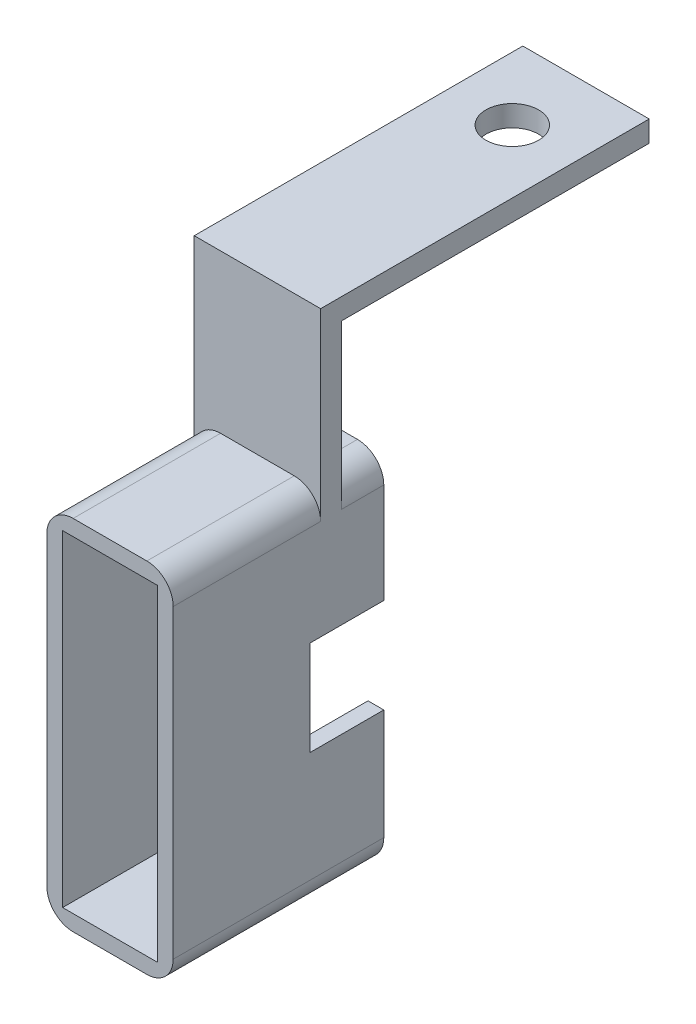
ISO-10303-21;
HEADER;
FILE_DESCRIPTION(('STEP AP214'),'2;1');
FILE_NAME('part.step','',(''),(''),'','','');
FILE_SCHEMA(('AUTOMOTIVE_DESIGN { 1 0 10303 214 1 1 1 1 }'));
ENDSEC;
DATA;
#1=APPLICATION_CONTEXT('core data for automotive mechanical design processes');
#2=APPLICATION_PROTOCOL_DEFINITION('international standard','automotive_design',2000,#1);
#3=PRODUCT_CONTEXT('',#1,'mechanical');
#4=PRODUCT('Part','Part','',(#3));
#5=PRODUCT_RELATED_PRODUCT_CATEGORY('part','',(#4));
#6=PRODUCT_DEFINITION_FORMATION('','',#4);
#7=PRODUCT_DEFINITION_CONTEXT('part definition',#1,'design');
#8=PRODUCT_DEFINITION('design','',#6,#7);
#9=PRODUCT_DEFINITION_SHAPE('','',#8);
#10=(LENGTH_UNIT() NAMED_UNIT(*) SI_UNIT(.MILLI.,.METRE.));
#11=(NAMED_UNIT(*) PLANE_ANGLE_UNIT() SI_UNIT($,.RADIAN.));
#12=(NAMED_UNIT(*) SI_UNIT($,.STERADIAN.) SOLID_ANGLE_UNIT());
#13=UNCERTAINTY_MEASURE_WITH_UNIT(LENGTH_MEASURE(1.E-05),#10,'distance_accuracy_value','');
#14=(GEOMETRIC_REPRESENTATION_CONTEXT(3) GLOBAL_UNCERTAINTY_ASSIGNED_CONTEXT((#13)) GLOBAL_UNIT_ASSIGNED_CONTEXT((#10,
#11,#12)) REPRESENTATION_CONTEXT('',''));
#15=CARTESIAN_POINT('',(0.,0.,0.));
#16=DIRECTION('',(0.,0.,1.));
#17=DIRECTION('',(1.,0.,0.));
#18=AXIS2_PLACEMENT_3D('',#15,#16,#17);
#19=CARTESIAN_POINT('',(0.,0.,0.));
#20=DIRECTION('',(0.,0.,1.));
#21=DIRECTION('',(1.,0.,0.));
#22=AXIS2_PLACEMENT_3D('',#19,#20,#21);
#23=PLANE('',#22);
#24=DIRECTION('',(0.,1.,0.));
#25=VECTOR('',#24,1.);
#26=CARTESIAN_POINT('',(-10.2757146611833,-16.7781690140845,0.));
#27=LINE('',#26,#25);
#28=CARTESIAN_POINT('',(-10.2757146611833,5.2218309859155,0.));
#29=VERTEX_POINT('',#28);
#30=CARTESIAN_POINT('',(-10.2757146611833,14.7218309859155,0.));
#31=VERTEX_POINT('',#30);
#32=EDGE_CURVE('E247',#29,#31,#27,.T.);
#33=ORIENTED_EDGE('',*,*,#32,.F.);
#34=DIRECTION('',(-1.,0.,0.));
#35=VECTOR('',#34,1.);
#36=CARTESIAN_POINT('',(-10.2757026611833,5.2218309859155,0.));
#37=LINE('',#36,#35);
#38=CARTESIAN_POINT('',(-11.7757146611833,5.2218309859155,0.));
#39=VERTEX_POINT('',#38);
#40=EDGE_CURVE('E239',#29,#39,#37,.T.);
#41=ORIENTED_EDGE('',*,*,#40,.T.);
#42=DIRECTION('',(0.,1.,0.));
#43=VECTOR('',#42,1.);
#44=CARTESIAN_POINT('',(-11.7757146611833,15.7218309859155,0.));
#45=LINE('',#44,#43);
#46=CARTESIAN_POINT('',(-11.7757146611833,15.7218309859155,0.));
#47=VERTEX_POINT('',#46);
#48=EDGE_CURVE('E343',#39,#47,#45,.T.);
#49=ORIENTED_EDGE('',*,*,#48,.T.);
#50=DIRECTION('',(-1.,0.,0.));
#51=VECTOR('',#50,1.);
#52=CARTESIAN_POINT('',(-20.7757146611833,15.7218309859155,0.));
#53=LINE('',#52,#51);
#54=CARTESIAN_POINT('',(-20.7757146611833,15.7218309859155,0.));
#55=VERTEX_POINT('',#54);
#56=EDGE_CURVE('E429',#47,#55,#53,.T.);
#57=ORIENTED_EDGE('',*,*,#56,.T.);
#58=DIRECTION('',(0.,-1.,0.));
#59=VECTOR('',#58,1.);
#60=CARTESIAN_POINT('',(-20.7757146611833,15.7218309859155,0.));
#61=LINE('',#60,#59);
#62=CARTESIAN_POINT('',(-20.7757146611833,7.22183098591549,0.));
#63=VERTEX_POINT('',#62);
#64=EDGE_CURVE('E352',#55,#63,#61,.T.);
#65=ORIENTED_EDGE('',*,*,#64,.T.);
#66=DIRECTION('',(1.,0.,0.));
#67=VECTOR('',#66,1.);
#68=CARTESIAN_POINT('',(-22.2757266611833,7.22183098591549,0.));
#69=LINE('',#68,#67);
#70=CARTESIAN_POINT('',(-22.2757146611833,7.22183098591549,0.));
#71=VERTEX_POINT('',#70);
#72=EDGE_CURVE('E60',#71,#63,#69,.T.);
#73=ORIENTED_EDGE('',*,*,#72,.F.);
#74=DIRECTION('',(0.,-1.,0.));
#75=VECTOR('',#74,1.);
#76=CARTESIAN_POINT('',(-22.2757146611833,-12.7781690140845,0.));
#77=LINE('',#76,#75);
#78=CARTESIAN_POINT('',(-22.2757146611833,14.7218309859155,0.));
#79=VERTEX_POINT('',#78);
#80=EDGE_CURVE('E375',#79,#71,#77,.T.);
#81=ORIENTED_EDGE('',*,*,#80,.F.);
#82=CARTESIAN_POINT('',(-19.7757146611833,14.7218309859155,0.));
#83=DIRECTION('',(0.,0.,1.));
#84=DIRECTION('',(1.,0.,0.));
#85=AXIS2_PLACEMENT_3D('',#82,#83,#84);
#86=CIRCLE('',#85,2.5);
#87=CARTESIAN_POINT('',(-19.7757146611833,17.2218309859155,0.));
#88=VERTEX_POINT('',#87);
#89=EDGE_CURVE('E288',#79,#88,#86,.F.);
#90=ORIENTED_EDGE('',*,*,#89,.T.);
#91=DIRECTION('',(-1.,0.,0.));
#92=VECTOR('',#91,1.);
#93=CARTESIAN_POINT('',(-10.2757146611833,17.2218309859155,0.));
#94=LINE('',#93,#92);
#95=CARTESIAN_POINT('',(-12.7757146611833,17.2218309859155,0.));
#96=VERTEX_POINT('',#95);
#97=EDGE_CURVE('E246',#96,#88,#94,.T.);
#98=ORIENTED_EDGE('',*,*,#97,.F.);
#99=CARTESIAN_POINT('',(-12.7757146611833,14.7218309859155,0.));
#100=DIRECTION('',(0.,0.,1.));
#101=DIRECTION('',(1.,0.,0.));
#102=AXIS2_PLACEMENT_3D('',#99,#100,#101);
#103=CIRCLE('',#102,2.5);
#104=EDGE_CURVE('E290',#96,#31,#103,.F.);
#105=ORIENTED_EDGE('',*,*,#104,.T.);
#106=EDGE_LOOP('',(#33,#41,#49,#57,#65,#73,#81,#90,#98,#105));
#107=FACE_BOUND('',#106,.T.);
#108=ADVANCED_FACE('F37',(#107),#23,.F.);
#109=CARTESIAN_POINT('',(-22.2757146611833,32.2218309859155,4.));
#110=DIRECTION('',(0.,0.,1.));
#111=DIRECTION('',(1.,0.,0.));
#112=AXIS2_PLACEMENT_3D('',#109,#110,#111);
#113=PLANE('',#112);
#114=DIRECTION('',(-1.,0.,0.));
#115=VECTOR('',#114,1.);
#116=CARTESIAN_POINT('',(-10.2757146611833,30.2218309859155,4.));
#117=LINE('',#116,#115);
#118=CARTESIAN_POINT('',(-10.2757146611833,30.2218309859155,4.));
#119=VERTEX_POINT('',#118);
#120=CARTESIAN_POINT('',(-22.2757146611833,30.2218309859155,4.));
#121=VERTEX_POINT('',#120);
#122=EDGE_CURVE('E259',#119,#121,#117,.T.);
#123=ORIENTED_EDGE('',*,*,#122,.F.);
#124=DIRECTION('',(0.,-1.,0.));
#125=VECTOR('',#124,1.);
#126=CARTESIAN_POINT('',(-10.2757146611833,32.2218309859155,4.));
#127=LINE('',#126,#125);
#128=CARTESIAN_POINT('',(-10.2757146611833,14.7218309859155,4.));
#129=VERTEX_POINT('',#128);
#130=EDGE_CURVE('E433',#119,#129,#127,.T.);
#131=ORIENTED_EDGE('',*,*,#130,.T.);
#132=CARTESIAN_POINT('',(-12.7757146611833,14.7218309859155,4.));
#133=DIRECTION('',(0.,0.,1.));
#134=DIRECTION('',(1.,0.,0.));
#135=AXIS2_PLACEMENT_3D('',#132,#133,#134);
#136=CIRCLE('',#135,2.5);
#137=CARTESIAN_POINT('',(-12.7757146611833,17.2218309859155,4.));
#138=VERTEX_POINT('',#137);
#139=EDGE_CURVE('E313',#129,#138,#136,.T.);
#140=ORIENTED_EDGE('',*,*,#139,.T.);
#141=DIRECTION('',(-1.,0.,0.));
#142=VECTOR('',#141,1.);
#143=CARTESIAN_POINT('',(-22.2757146611833,17.2218309859155,4.));
#144=LINE('',#143,#142);
#145=CARTESIAN_POINT('',(-19.7757146611833,17.2218309859155,4.));
#146=VERTEX_POINT('',#145);
#147=EDGE_CURVE('E748',#138,#146,#144,.T.);
#148=ORIENTED_EDGE('',*,*,#147,.T.);
#149=CARTESIAN_POINT('',(-19.7757146611833,14.7218309859155,4.));
#150=DIRECTION('',(0.,0.,1.));
#151=DIRECTION('',(1.,0.,0.));
#152=AXIS2_PLACEMENT_3D('',#149,#150,#151);
#153=CIRCLE('',#152,2.5);
#154=CARTESIAN_POINT('',(-22.2757146611833,14.7218309859155,4.));
#155=VERTEX_POINT('',#154);
#156=EDGE_CURVE('E315',#146,#155,#153,.T.);
#157=ORIENTED_EDGE('',*,*,#156,.T.);
#158=DIRECTION('',(0.,-1.,0.));
#159=VECTOR('',#158,1.);
#160=CARTESIAN_POINT('',(-22.2757146611833,32.2218309859155,4.));
#161=LINE('',#160,#159);
#162=EDGE_CURVE('E759',#121,#155,#161,.T.);
#163=ORIENTED_EDGE('',*,*,#162,.F.);
#164=EDGE_LOOP('',(#123,#131,#140,#148,#157,#163));
#165=FACE_BOUND('',#164,.T.);
#166=ADVANCED_FACE('F471',(#165),#113,.F.);
#167=CARTESIAN_POINT('',(-10.2757146611833,17.2218309859155,20.));
#168=DIRECTION('',(0.,-1.,0.));
#169=DIRECTION('',(0.,0.,-1.));
#170=AXIS2_PLACEMENT_3D('',#167,#168,#169);
#171=PLANE('',#170);
#172=ORIENTED_EDGE('',*,*,#147,.F.);
#173=DIRECTION('',(0.,0.,-1.));
#174=VECTOR('',#173,1.);
#175=CARTESIAN_POINT('',(-12.7757146611833,17.2218309859155,20.));
#176=LINE('',#175,#174);
#177=EDGE_CURVE('E282',#138,#96,#176,.T.);
#178=ORIENTED_EDGE('',*,*,#177,.T.);
#179=ORIENTED_EDGE('',*,*,#97,.T.);
#180=DIRECTION('',(0.,0.,-1.));
#181=VECTOR('',#180,1.);
#182=CARTESIAN_POINT('',(-19.7757146611833,17.2218309859155,20.));
#183=LINE('',#182,#181);
#184=EDGE_CURVE('E280',#88,#146,#183,.F.);
#185=ORIENTED_EDGE('',*,*,#184,.T.);
#186=EDGE_LOOP('',(#172,#178,#179,#185));
#187=FACE_BOUND('',#186,.T.);
#188=ADVANCED_FACE('F467',(#187),#171,.F.);
#189=DIRECTION('',(1.,0.,0.));
#190=VECTOR('',#189,1.);
#191=CARTESIAN_POINT('',(-22.2757146611833,17.2218309859155,6.));
#192=LINE('',#191,#190);
#193=CARTESIAN_POINT('',(-19.7757146611833,17.2218309859155,6.));
#194=VERTEX_POINT('',#193);
#195=CARTESIAN_POINT('',(-12.7757146611833,17.2218309859155,6.));
#196=VERTEX_POINT('',#195);
#197=EDGE_CURVE('E418',#194,#196,#192,.T.);
#198=ORIENTED_EDGE('',*,*,#197,.F.);
#199=DIRECTION('',(0.,0.,-1.));
#200=VECTOR('',#199,1.);
#201=CARTESIAN_POINT('',(-19.7757146611833,17.2218309859155,20.));
#202=LINE('',#201,#200);
#203=CARTESIAN_POINT('',(-19.7757146611833,17.2218309859155,20.));
#204=VERTEX_POINT('',#203);
#205=EDGE_CURVE('E311',#194,#204,#202,.F.);
#206=ORIENTED_EDGE('',*,*,#205,.T.);
#207=DIRECTION('',(-1.,0.,0.));
#208=VECTOR('',#207,1.);
#209=CARTESIAN_POINT('',(-10.2757146611833,17.2218309859155,20.));
#210=LINE('',#209,#208);
#211=CARTESIAN_POINT('',(-12.7757146611833,17.2218309859155,20.));
#212=VERTEX_POINT('',#211);
#213=EDGE_CURVE('E263',#212,#204,#210,.T.);
#214=ORIENTED_EDGE('',*,*,#213,.F.);
#215=DIRECTION('',(0.,0.,-1.));
#216=VECTOR('',#215,1.);
#217=CARTESIAN_POINT('',(-12.7757146611833,17.2218309859155,20.));
#218=LINE('',#217,#216);
#219=EDGE_CURVE('E274',#212,#196,#218,.T.);
#220=ORIENTED_EDGE('',*,*,#219,.T.);
#221=EDGE_LOOP('',(#198,#206,#214,#220));
#222=FACE_BOUND('',#221,.T.);
#223=ADVANCED_FACE('F416',(#222),#171,.F.);
#224=CARTESIAN_POINT('',(0.,0.,20.));
#225=DIRECTION('',(0.,0.,1.));
#226=DIRECTION('',(1.,0.,0.));
#227=AXIS2_PLACEMENT_3D('',#224,#225,#226);
#228=PLANE('',#227);
#229=DIRECTION('',(0.,-1.,0.));
#230=VECTOR('',#229,1.);
#231=CARTESIAN_POINT('',(-22.2757146611833,17.2218309859155,20.));
#232=LINE('',#231,#230);
#233=CARTESIAN_POINT('',(-22.2757146611833,14.7218309859155,20.));
#234=VERTEX_POINT('',#233);
#235=CARTESIAN_POINT('',(-22.2757146611833,-14.2781690140845,20.));
#236=VERTEX_POINT('',#235);
#237=EDGE_CURVE('E250',#234,#236,#232,.T.);
#238=ORIENTED_EDGE('',*,*,#237,.T.);
#239=CARTESIAN_POINT('',(-19.7757146611833,-14.2781690140845,20.));
#240=DIRECTION('',(0.,0.,1.));
#241=DIRECTION('',(1.,0.,0.));
#242=AXIS2_PLACEMENT_3D('',#239,#240,#241);
#243=CIRCLE('',#242,2.5);
#244=CARTESIAN_POINT('',(-19.7757146611833,-16.7781690140845,20.));
#245=VERTEX_POINT('',#244);
#246=EDGE_CURVE('E309',#236,#245,#243,.T.);
#247=ORIENTED_EDGE('',*,*,#246,.T.);
#248=DIRECTION('',(1.,0.,0.));
#249=VECTOR('',#248,1.);
#250=CARTESIAN_POINT('',(-22.2757146611833,-16.7781690140845,20.));
#251=LINE('',#250,#249);
#252=CARTESIAN_POINT('',(-12.7757146611833,-16.7781690140845,20.));
#253=VERTEX_POINT('',#252);
#254=EDGE_CURVE('E369',#245,#253,#251,.T.);
#255=ORIENTED_EDGE('',*,*,#254,.T.);
#256=CARTESIAN_POINT('',(-12.7757146611833,-14.2781690140845,20.));
#257=DIRECTION('',(0.,0.,1.));
#258=DIRECTION('',(1.,0.,0.));
#259=AXIS2_PLACEMENT_3D('',#256,#257,#258);
#260=CIRCLE('',#259,2.5);
#261=CARTESIAN_POINT('',(-10.2757146611833,-14.2781690140845,20.));
#262=VERTEX_POINT('',#261);
#263=EDGE_CURVE('E272',#253,#262,#260,.T.);
#264=ORIENTED_EDGE('',*,*,#263,.T.);
#265=DIRECTION('',(0.,1.,0.));
#266=VECTOR('',#265,1.);
#267=CARTESIAN_POINT('',(-10.2757146611833,-16.7781690140845,20.));
#268=LINE('',#267,#266);
#269=CARTESIAN_POINT('',(-10.2757146611833,14.7218309859155,20.));
#270=VERTEX_POINT('',#269);
#271=EDGE_CURVE('E371',#262,#270,#268,.T.);
#272=ORIENTED_EDGE('',*,*,#271,.T.);
#273=CARTESIAN_POINT('',(-12.7757146611833,14.7218309859155,20.));
#274=DIRECTION('',(0.,0.,1.));
#275=DIRECTION('',(1.,0.,0.));
#276=AXIS2_PLACEMENT_3D('',#273,#274,#275);
#277=CIRCLE('',#276,2.5);
#278=EDGE_CURVE('E270',#270,#212,#277,.T.);
#279=ORIENTED_EDGE('',*,*,#278,.T.);
#280=ORIENTED_EDGE('',*,*,#213,.T.);
#281=CARTESIAN_POINT('',(-19.7757146611833,14.7218309859155,20.));
#282=DIRECTION('',(0.,0.,1.));
#283=DIRECTION('',(1.,0.,0.));
#284=AXIS2_PLACEMENT_3D('',#281,#282,#283);
#285=CIRCLE('',#284,2.5);
#286=EDGE_CURVE('E307',#204,#234,#285,.T.);
#287=ORIENTED_EDGE('',*,*,#286,.T.);
#288=EDGE_LOOP('',(#238,#247,#255,#264,#272,#279,#280,#287));
#289=FACE_BOUND('',#288,.T.);
#290=DIRECTION('',(0.,-1.,0.));
#291=VECTOR('',#290,1.);
#292=CARTESIAN_POINT('',(-20.7757146611833,15.7218309859155,20.));
#293=LINE('',#292,#291);
#294=CARTESIAN_POINT('',(-20.7757146611833,15.7218309859155,20.));
#295=VERTEX_POINT('',#294);
#296=CARTESIAN_POINT('',(-20.7757146611833,-15.2781690140845,20.));
#297=VERTEX_POINT('',#296);
#298=EDGE_CURVE('E438',#295,#297,#293,.T.);
#299=ORIENTED_EDGE('',*,*,#298,.F.);
#300=DIRECTION('',(-1.,0.,0.));
#301=VECTOR('',#300,1.);
#302=CARTESIAN_POINT('',(-20.7757146611833,15.7218309859155,20.));
#303=LINE('',#302,#301);
#304=CARTESIAN_POINT('',(-11.7757146611833,15.7218309859155,20.));
#305=VERTEX_POINT('',#304);
#306=EDGE_CURVE('E351',#305,#295,#303,.T.);
#307=ORIENTED_EDGE('',*,*,#306,.F.);
#308=DIRECTION('',(0.,1.,0.));
#309=VECTOR('',#308,1.);
#310=CARTESIAN_POINT('',(-11.7757146611833,15.7218309859155,20.));
#311=LINE('',#310,#309);
#312=CARTESIAN_POINT('',(-11.7757146611833,-15.2781690140845,20.));
#313=VERTEX_POINT('',#312);
#314=EDGE_CURVE('E358',#313,#305,#311,.T.);
#315=ORIENTED_EDGE('',*,*,#314,.F.);
#316=DIRECTION('',(1.,0.,0.));
#317=VECTOR('',#316,1.);
#318=CARTESIAN_POINT('',(-20.7757146611833,-15.2781690140845,20.));
#319=LINE('',#318,#317);
#320=EDGE_CURVE('E440',#297,#313,#319,.T.);
#321=ORIENTED_EDGE('',*,*,#320,.F.);
#322=EDGE_LOOP('',(#299,#307,#315,#321));
#323=FACE_BOUND('',#322,.T.);
#324=ADVANCED_FACE('F395',(#289,#323),#228,.T.);
#325=CARTESIAN_POINT('',(-11.7757146611833,-15.2781690140845,0.));
#326=VERTEX_POINT('',#325);
#327=CARTESIAN_POINT('',(-11.7757146611833,-3.77816901408451,0.));
#328=VERTEX_POINT('',#327);
#329=EDGE_CURVE('E238',#326,#328,#45,.T.);
#330=ORIENTED_EDGE('',*,*,#329,.T.);
#331=DIRECTION('',(-1.,0.,0.));
#332=VECTOR('',#331,1.);
#333=CARTESIAN_POINT('',(-10.2757026611833,-3.77816901408451,0.));
#334=LINE('',#333,#332);
#335=CARTESIAN_POINT('',(-10.2757146611833,-3.77816901408451,0.));
#336=VERTEX_POINT('',#335);
#337=EDGE_CURVE('E52',#336,#328,#334,.T.);
#338=ORIENTED_EDGE('',*,*,#337,.F.);
#339=CARTESIAN_POINT('',(-10.2757146611833,-14.2781690140845,0.));
#340=VERTEX_POINT('',#339);
#341=EDGE_CURVE('E235',#340,#336,#27,.T.);
#342=ORIENTED_EDGE('',*,*,#341,.F.);
#343=CARTESIAN_POINT('',(-12.7757146611833,-14.2781690140845,0.));
#344=DIRECTION('',(0.,0.,1.));
#345=DIRECTION('',(1.,0.,0.));
#346=AXIS2_PLACEMENT_3D('',#343,#344,#345);
#347=CIRCLE('',#346,2.5);
#348=CARTESIAN_POINT('',(-12.7757146611833,-16.7781690140845,0.));
#349=VERTEX_POINT('',#348);
#350=EDGE_CURVE('E265',#340,#349,#347,.F.);
#351=ORIENTED_EDGE('',*,*,#350,.T.);
#352=DIRECTION('',(1.,0.,0.));
#353=VECTOR('',#352,1.);
#354=CARTESIAN_POINT('',(-22.2757146611833,-16.7781690140845,0.));
#355=LINE('',#354,#353);
#356=CARTESIAN_POINT('',(-19.7757146611833,-16.7781690140845,0.));
#357=VERTEX_POINT('',#356);
#358=EDGE_CURVE('E252',#357,#349,#355,.T.);
#359=ORIENTED_EDGE('',*,*,#358,.F.);
#360=CARTESIAN_POINT('',(-19.7757146611833,-14.2781690140845,0.));
#361=DIRECTION('',(0.,0.,1.));
#362=DIRECTION('',(1.,0.,0.));
#363=AXIS2_PLACEMENT_3D('',#360,#361,#362);
#364=CIRCLE('',#363,2.5);
#365=CARTESIAN_POINT('',(-22.2757146611833,-14.2781690140845,0.));
#366=VERTEX_POINT('',#365);
#367=EDGE_CURVE('E285',#357,#366,#364,.F.);
#368=ORIENTED_EDGE('',*,*,#367,.T.);
#369=CARTESIAN_POINT('',(-22.2757146611833,-3.77816901408451,0.));
#370=VERTEX_POINT('',#369);
#371=EDGE_CURVE('E366',#370,#366,#77,.T.);
#372=ORIENTED_EDGE('',*,*,#371,.F.);
#373=DIRECTION('',(1.,0.,0.));
#374=VECTOR('',#373,1.);
#375=CARTESIAN_POINT('',(-22.2757266611833,-3.77816901408451,0.));
#376=LINE('',#375,#374);
#377=CARTESIAN_POINT('',(-20.7757146611833,-3.77816901408451,0.));
#378=VERTEX_POINT('',#377);
#379=EDGE_CURVE('E446',#370,#378,#376,.T.);
#380=ORIENTED_EDGE('',*,*,#379,.T.);
#381=CARTESIAN_POINT('',(-20.7757146611833,-15.2781690140845,0.));
#382=VERTEX_POINT('',#381);
#383=EDGE_CURVE('E431',#378,#382,#61,.T.);
#384=ORIENTED_EDGE('',*,*,#383,.T.);
#385=DIRECTION('',(1.,0.,0.));
#386=VECTOR('',#385,1.);
#387=CARTESIAN_POINT('',(-20.7757146611833,-15.2781690140845,0.));
#388=LINE('',#387,#386);
#389=EDGE_CURVE('E349',#382,#326,#388,.T.);
#390=ORIENTED_EDGE('',*,*,#389,.T.);
#391=EDGE_LOOP('',(#330,#338,#342,#351,#359,#368,#372,#380,#384,#390));
#392=FACE_BOUND('',#391,.T.);
#393=ADVANCED_FACE('F233',(#392),#23,.F.);
#394=CARTESIAN_POINT('',(-22.2757146611833,-12.7781690140845,20.));
#395=DIRECTION('',(1.,0.,0.));
#396=DIRECTION('',(0.,0.,-1.));
#397=AXIS2_PLACEMENT_3D('',#394,#395,#396);
#398=PLANE('',#397);
#399=DIRECTION('',(0.,-1.,0.));
#400=VECTOR('',#399,1.);
#401=CARTESIAN_POINT('',(-22.2757146611833,-12.7781690140845,7.));
#402=LINE('',#401,#400);
#403=CARTESIAN_POINT('',(-22.2757146611833,7.22183098591549,7.));
#404=VERTEX_POINT('',#403);
#405=CARTESIAN_POINT('',(-22.2757146611833,-3.77816901408451,7.));
#406=VERTEX_POINT('',#405);
#407=EDGE_CURVE('E789',#404,#406,#402,.T.);
#408=ORIENTED_EDGE('',*,*,#407,.T.);
#409=DIRECTION('',(0.,0.,-1.));
#410=VECTOR('',#409,1.);
#411=CARTESIAN_POINT('',(-22.2757146611833,-3.7781690140845,20.));
#412=LINE('',#411,#410);
#413=EDGE_CURVE('E386',#406,#370,#412,.T.);
#414=ORIENTED_EDGE('',*,*,#413,.T.);
#415=ORIENTED_EDGE('',*,*,#371,.T.);
#416=DIRECTION('',(0.,0.,-1.));
#417=VECTOR('',#416,1.);
#418=CARTESIAN_POINT('',(-22.2757146611833,-14.2781690140845,20.));
#419=LINE('',#418,#417);
#420=EDGE_CURVE('E299',#366,#236,#419,.F.);
#421=ORIENTED_EDGE('',*,*,#420,.T.);
#422=ORIENTED_EDGE('',*,*,#237,.F.);
#423=DIRECTION('',(0.,0.,-1.));
#424=VECTOR('',#423,1.);
#425=CARTESIAN_POINT('',(-22.2757146611833,14.7218309859155,20.));
#426=LINE('',#425,#424);
#427=CARTESIAN_POINT('',(-22.2757146611833,14.7218309859155,6.));
#428=VERTEX_POINT('',#427);
#429=EDGE_CURVE('E296',#234,#428,#426,.T.);
#430=ORIENTED_EDGE('',*,*,#429,.T.);
#431=DIRECTION('',(0.,-1.,0.));
#432=VECTOR('',#431,1.);
#433=CARTESIAN_POINT('',(-22.2757146611833,32.2218309859155,6.));
#434=LINE('',#433,#432);
#435=CARTESIAN_POINT('',(-22.2757146611833,32.2218309859155,6.));
#436=VERTEX_POINT('',#435);
#437=EDGE_CURVE('E423',#436,#428,#434,.T.);
#438=ORIENTED_EDGE('',*,*,#437,.F.);
#439=DIRECTION('',(0.,0.,1.));
#440=VECTOR('',#439,1.);
#441=CARTESIAN_POINT('',(-22.2757146611833,32.2218309859155,4.));
#442=LINE('',#441,#440);
#443=CARTESIAN_POINT('',(-22.2757146611833,32.2218309859155,-25.2));
#444=VERTEX_POINT('',#443);
#445=EDGE_CURVE('E426',#444,#436,#442,.T.);
#446=ORIENTED_EDGE('',*,*,#445,.F.);
#447=DIRECTION('',(0.,1.,0.));
#448=VECTOR('',#447,1.);
#449=CARTESIAN_POINT('',(-22.2757146611833,30.2218309859155,-25.2));
#450=LINE('',#449,#448);
#451=CARTESIAN_POINT('',(-22.2757146611833,30.2218309859155,-25.2));
#452=VERTEX_POINT('',#451);
#453=EDGE_CURVE('E776',#452,#444,#450,.T.);
#454=ORIENTED_EDGE('',*,*,#453,.F.);
#455=DIRECTION('',(0.,0.,1.));
#456=VECTOR('',#455,1.);
#457=CARTESIAN_POINT('',(-22.2757146611833,30.2218309859155,-25.2));
#458=LINE('',#457,#456);
#459=EDGE_CURVE('E775',#452,#121,#458,.T.);
#460=ORIENTED_EDGE('',*,*,#459,.T.);
#461=ORIENTED_EDGE('',*,*,#162,.T.);
#462=DIRECTION('',(0.,0.,-1.));
#463=VECTOR('',#462,1.);
#464=CARTESIAN_POINT('',(-22.2757146611833,14.7218309859155,20.));
#465=LINE('',#464,#463);
#466=EDGE_CURVE('E301',#155,#79,#465,.T.);
#467=ORIENTED_EDGE('',*,*,#466,.T.);
#468=ORIENTED_EDGE('',*,*,#80,.T.);
#469=DIRECTION('',(0.,0.,1.));
#470=VECTOR('',#469,1.);
#471=CARTESIAN_POINT('',(-22.2757146611833,7.22183098591549,20.));
#472=LINE('',#471,#470);
#473=EDGE_CURVE('E791',#71,#404,#472,.T.);
#474=ORIENTED_EDGE('',*,*,#473,.T.);
#475=EDGE_LOOP('',(#408,#414,#415,#421,#422,#430,#438,#446,#454,#460,#461,#467,#468,#474));
#476=FACE_BOUND('',#475,.T.);
#477=ADVANCED_FACE('F383',(#476),#398,.F.);
#478=CARTESIAN_POINT('',(-22.2757146611833,-16.7781690140845,20.));
#479=DIRECTION('',(0.,1.,0.));
#480=DIRECTION('',(0.,0.,1.));
#481=AXIS2_PLACEMENT_3D('',#478,#479,#480);
#482=PLANE('',#481);
#483=ORIENTED_EDGE('',*,*,#254,.F.);
#484=DIRECTION('',(0.,0.,-1.));
#485=VECTOR('',#484,1.);
#486=CARTESIAN_POINT('',(-19.7757146611833,-16.7781690140845,20.));
#487=LINE('',#486,#485);
#488=EDGE_CURVE('E304',#245,#357,#487,.T.);
#489=ORIENTED_EDGE('',*,*,#488,.T.);
#490=ORIENTED_EDGE('',*,*,#358,.T.);
#491=DIRECTION('',(0.,0.,-1.));
#492=VECTOR('',#491,1.);
#493=CARTESIAN_POINT('',(-12.7757146611833,-16.7781690140845,20.));
#494=LINE('',#493,#492);
#495=EDGE_CURVE('E267',#349,#253,#494,.F.);
#496=ORIENTED_EDGE('',*,*,#495,.T.);
#497=EDGE_LOOP('',(#483,#489,#490,#496));
#498=FACE_BOUND('',#497,.T.);
#499=ADVANCED_FACE('F398',(#498),#482,.F.);
#500=CARTESIAN_POINT('',(-10.2757146611833,-16.7781690140845,20.));
#501=DIRECTION('',(-1.,0.,0.));
#502=DIRECTION('',(0.,0.,1.));
#503=AXIS2_PLACEMENT_3D('',#500,#501,#502);
#504=PLANE('',#503);
#505=DIRECTION('',(0.,1.,0.));
#506=VECTOR('',#505,1.);
#507=CARTESIAN_POINT('',(-10.2757146611833,-16.7781690140845,7.));
#508=LINE('',#507,#506);
#509=CARTESIAN_POINT('',(-10.2757146611833,-3.77816901408451,7.));
#510=VERTEX_POINT('',#509);
#511=CARTESIAN_POINT('',(-10.2757146611833,5.2218309859155,7.));
#512=VERTEX_POINT('',#511);
#513=EDGE_CURVE('E227',#510,#512,#508,.T.);
#514=ORIENTED_EDGE('',*,*,#513,.T.);
#515=DIRECTION('',(0.,0.,-1.));
#516=VECTOR('',#515,1.);
#517=CARTESIAN_POINT('',(-10.2757146611833,5.2218309859155,20.));
#518=LINE('',#517,#516);
#519=EDGE_CURVE('E338',#512,#29,#518,.T.);
#520=ORIENTED_EDGE('',*,*,#519,.T.);
#521=ORIENTED_EDGE('',*,*,#32,.T.);
#522=DIRECTION('',(0.,0.,-1.));
#523=VECTOR('',#522,1.);
#524=CARTESIAN_POINT('',(-10.2757146611833,14.7218309859155,20.));
#525=LINE('',#524,#523);
#526=EDGE_CURVE('E293',#31,#129,#525,.F.);
#527=ORIENTED_EDGE('',*,*,#526,.T.);
#528=ORIENTED_EDGE('',*,*,#130,.F.);
#529=DIRECTION('',(0.,0.,1.));
#530=VECTOR('',#529,1.);
#531=CARTESIAN_POINT('',(-10.2757146611833,30.2218309859155,-25.2));
#532=LINE('',#531,#530);
#533=CARTESIAN_POINT('',(-10.2757146611833,30.2218309859155,-25.2));
#534=VERTEX_POINT('',#533);
#535=EDGE_CURVE('E755',#534,#119,#532,.T.);
#536=ORIENTED_EDGE('',*,*,#535,.F.);
#537=DIRECTION('',(0.,-1.,0.));
#538=VECTOR('',#537,1.);
#539=CARTESIAN_POINT('',(-10.2757146611833,32.2218309859155,-25.2));
#540=LINE('',#539,#538);
#541=CARTESIAN_POINT('',(-10.2757146611833,32.2218309859155,-25.2));
#542=VERTEX_POINT('',#541);
#543=EDGE_CURVE('E780',#542,#534,#540,.T.);
#544=ORIENTED_EDGE('',*,*,#543,.F.);
#545=DIRECTION('',(0.,0.,-1.));
#546=VECTOR('',#545,1.);
#547=CARTESIAN_POINT('',(-10.2757146611833,32.2218309859155,6.));
#548=LINE('',#547,#546);
#549=CARTESIAN_POINT('',(-10.2757146611833,32.2218309859155,6.));
#550=VERTEX_POINT('',#549);
#551=EDGE_CURVE('E750',#550,#542,#548,.T.);
#552=ORIENTED_EDGE('',*,*,#551,.F.);
#553=DIRECTION('',(0.,-1.,0.));
#554=VECTOR('',#553,1.);
#555=CARTESIAN_POINT('',(-10.2757146611833,32.2218309859155,6.));
#556=LINE('',#555,#554);
#557=CARTESIAN_POINT('',(-10.2757146611833,14.7218309859155,6.));
#558=VERTEX_POINT('',#557);
#559=EDGE_CURVE('E407',#550,#558,#556,.T.);
#560=ORIENTED_EDGE('',*,*,#559,.T.);
#561=DIRECTION('',(0.,0.,-1.));
#562=VECTOR('',#561,1.);
#563=CARTESIAN_POINT('',(-10.2757146611833,14.7218309859155,20.));
#564=LINE('',#563,#562);
#565=EDGE_CURVE('E261',#558,#270,#564,.F.);
#566=ORIENTED_EDGE('',*,*,#565,.T.);
#567=ORIENTED_EDGE('',*,*,#271,.F.);
#568=DIRECTION('',(0.,0.,-1.));
#569=VECTOR('',#568,1.);
#570=CARTESIAN_POINT('',(-10.2757146611833,-14.2781690140845,20.));
#571=LINE('',#570,#569);
#572=EDGE_CURVE('E245',#262,#340,#571,.T.);
#573=ORIENTED_EDGE('',*,*,#572,.T.);
#574=ORIENTED_EDGE('',*,*,#341,.T.);
#575=DIRECTION('',(0.,0.,1.));
#576=VECTOR('',#575,1.);
#577=CARTESIAN_POINT('',(-10.2757146611833,-3.77816901408451,20.));
#578=LINE('',#577,#576);
#579=EDGE_CURVE('E220',#336,#510,#578,.T.);
#580=ORIENTED_EDGE('',*,*,#579,.T.);
#581=EDGE_LOOP('',(#514,#520,#521,#527,#528,#536,#544,#552,#560,#566,#567,#573,#574,#580));
#582=FACE_BOUND('',#581,.T.);
#583=ADVANCED_FACE('F242',(#582),#504,.F.);
#584=CARTESIAN_POINT('',(-20.7757146611833,15.7218309859155,20.));
#585=DIRECTION('',(0.,-1.,0.));
#586=DIRECTION('',(1.,0.,0.));
#587=AXIS2_PLACEMENT_3D('',#584,#585,#586);
#588=PLANE('',#587);
#589=ORIENTED_EDGE('',*,*,#56,.F.);
#590=DIRECTION('',(0.,0.,-1.));
#591=VECTOR('',#590,1.);
#592=CARTESIAN_POINT('',(-11.7757146611833,15.7218309859155,20.));
#593=LINE('',#592,#591);
#594=EDGE_CURVE('E345',#305,#47,#593,.T.);
#595=ORIENTED_EDGE('',*,*,#594,.F.);
#596=ORIENTED_EDGE('',*,*,#306,.T.);
#597=DIRECTION('',(0.,0.,-1.));
#598=VECTOR('',#597,1.);
#599=CARTESIAN_POINT('',(-20.7757146611833,15.7218309859155,20.));
#600=LINE('',#599,#598);
#601=EDGE_CURVE('E363',#295,#55,#600,.T.);
#602=ORIENTED_EDGE('',*,*,#601,.T.);
#603=EDGE_LOOP('',(#589,#595,#596,#602));
#604=FACE_BOUND('',#603,.T.);
#605=ADVANCED_FACE('F459',(#604),#588,.T.);
#606=CARTESIAN_POINT('',(-20.7757146611833,15.7218309859155,20.));
#607=DIRECTION('',(1.,0.,0.));
#608=DIRECTION('',(0.,0.,-1.));
#609=AXIS2_PLACEMENT_3D('',#606,#607,#608);
#610=PLANE('',#609);
#611=DIRECTION('',(0.,0.,-1.));
#612=VECTOR('',#611,1.);
#613=CARTESIAN_POINT('',(-20.7757146611833,-3.77816901408451,20.));
#614=LINE('',#613,#612);
#615=CARTESIAN_POINT('',(-20.7757146611833,-3.77816901408451,7.));
#616=VERTEX_POINT('',#615);
#617=EDGE_CURVE('E324',#616,#378,#614,.T.);
#618=ORIENTED_EDGE('',*,*,#617,.F.);
#619=DIRECTION('',(0.,-1.,0.));
#620=VECTOR('',#619,1.);
#621=CARTESIAN_POINT('',(-20.7757146611833,15.7218309859155,7.));
#622=LINE('',#621,#620);
#623=CARTESIAN_POINT('',(-20.7757146611833,7.22183098591549,7.));
#624=VERTEX_POINT('',#623);
#625=EDGE_CURVE('E322',#624,#616,#622,.T.);
#626=ORIENTED_EDGE('',*,*,#625,.F.);
#627=DIRECTION('',(0.,0.,1.));
#628=VECTOR('',#627,1.);
#629=CARTESIAN_POINT('',(-20.7757146611833,7.22183098591549,20.));
#630=LINE('',#629,#628);
#631=EDGE_CURVE('E320',#63,#624,#630,.T.);
#632=ORIENTED_EDGE('',*,*,#631,.F.);
#633=ORIENTED_EDGE('',*,*,#64,.F.);
#634=ORIENTED_EDGE('',*,*,#601,.F.);
#635=ORIENTED_EDGE('',*,*,#298,.T.);
#636=DIRECTION('',(0.,0.,-1.));
#637=VECTOR('',#636,1.);
#638=CARTESIAN_POINT('',(-20.7757146611833,-15.2781690140845,20.));
#639=LINE('',#638,#637);
#640=EDGE_CURVE('E360',#297,#382,#639,.T.);
#641=ORIENTED_EDGE('',*,*,#640,.T.);
#642=ORIENTED_EDGE('',*,*,#383,.F.);
#643=EDGE_LOOP('',(#618,#626,#632,#633,#634,#635,#641,#642));
#644=FACE_BOUND('',#643,.T.);
#645=ADVANCED_FACE('F450',(#644),#610,.T.);
#646=CARTESIAN_POINT('',(-20.7757146611833,-15.2781690140845,20.));
#647=DIRECTION('',(0.,1.,0.));
#648=DIRECTION('',(0.,0.,1.));
#649=AXIS2_PLACEMENT_3D('',#646,#647,#648);
#650=PLANE('',#649);
#651=ORIENTED_EDGE('',*,*,#389,.F.);
#652=ORIENTED_EDGE('',*,*,#640,.F.);
#653=ORIENTED_EDGE('',*,*,#320,.T.);
#654=DIRECTION('',(0.,0.,-1.));
#655=VECTOR('',#654,1.);
#656=CARTESIAN_POINT('',(-11.7757146611833,-15.2781690140845,20.));
#657=LINE('',#656,#655);
#658=EDGE_CURVE('E357',#313,#326,#657,.T.);
#659=ORIENTED_EDGE('',*,*,#658,.T.);
#660=EDGE_LOOP('',(#651,#652,#653,#659));
#661=FACE_BOUND('',#660,.T.);
#662=ADVANCED_FACE('F455',(#661),#650,.T.);
#663=CARTESIAN_POINT('',(-11.7757146611833,15.7218309859155,20.));
#664=DIRECTION('',(-1.,0.,0.));
#665=DIRECTION('',(0.,-1.,0.));
#666=AXIS2_PLACEMENT_3D('',#663,#664,#665);
#667=PLANE('',#666);
#668=DIRECTION('',(0.,0.,-1.));
#669=VECTOR('',#668,1.);
#670=CARTESIAN_POINT('',(-11.7757146611833,5.2218309859155,20.));
#671=LINE('',#670,#669);
#672=CARTESIAN_POINT('',(-11.7757146611833,5.2218309859155,7.));
#673=VERTEX_POINT('',#672);
#674=EDGE_CURVE('E12',#673,#39,#671,.T.);
#675=ORIENTED_EDGE('',*,*,#674,.F.);
#676=DIRECTION('',(0.,1.,0.));
#677=VECTOR('',#676,1.);
#678=CARTESIAN_POINT('',(-11.7757146611833,15.7218309859155,7.));
#679=LINE('',#678,#677);
#680=CARTESIAN_POINT('',(-11.7757146611833,-3.77816901408451,7.));
#681=VERTEX_POINT('',#680);
#682=EDGE_CURVE('E45',#681,#673,#679,.T.);
#683=ORIENTED_EDGE('',*,*,#682,.F.);
#684=DIRECTION('',(0.,0.,1.));
#685=VECTOR('',#684,1.);
#686=CARTESIAN_POINT('',(-11.7757146611833,-3.77816901408451,20.));
#687=LINE('',#686,#685);
#688=EDGE_CURVE('E326',#328,#681,#687,.T.);
#689=ORIENTED_EDGE('',*,*,#688,.F.);
#690=ORIENTED_EDGE('',*,*,#329,.F.);
#691=ORIENTED_EDGE('',*,*,#658,.F.);
#692=ORIENTED_EDGE('',*,*,#314,.T.);
#693=ORIENTED_EDGE('',*,*,#594,.T.);
#694=ORIENTED_EDGE('',*,*,#48,.F.);
#695=EDGE_LOOP('',(#675,#683,#689,#690,#691,#692,#693,#694));
#696=FACE_BOUND('',#695,.T.);
#697=ADVANCED_FACE('F341',(#696),#667,.T.);
#698=CARTESIAN_POINT('',(-22.2757146611833,32.2218309859155,6.));
#699=DIRECTION('',(0.,0.,-1.));
#700=DIRECTION('',(-1.,0.,0.));
#701=AXIS2_PLACEMENT_3D('',#698,#699,#700);
#702=PLANE('',#701);
#703=ORIENTED_EDGE('',*,*,#437,.T.);
#704=CARTESIAN_POINT('',(-19.7757146611833,14.7218309859155,6.));
#705=DIRECTION('',(0.,0.,-1.));
#706=DIRECTION('',(-1.,0.,0.));
#707=AXIS2_PLACEMENT_3D('',#704,#705,#706);
#708=CIRCLE('',#707,2.5);
#709=EDGE_CURVE('E318',#428,#194,#708,.T.);
#710=ORIENTED_EDGE('',*,*,#709,.T.);
#711=ORIENTED_EDGE('',*,*,#197,.T.);
#712=CARTESIAN_POINT('',(-12.7757146611833,14.7218309859155,6.));
#713=DIRECTION('',(0.,0.,-1.));
#714=DIRECTION('',(-1.,0.,0.));
#715=AXIS2_PLACEMENT_3D('',#712,#713,#714);
#716=CIRCLE('',#715,2.5);
#717=EDGE_CURVE('E277',#196,#558,#716,.T.);
#718=ORIENTED_EDGE('',*,*,#717,.T.);
#719=ORIENTED_EDGE('',*,*,#559,.F.);
#720=DIRECTION('',(1.,0.,0.));
#721=VECTOR('',#720,1.);
#722=CARTESIAN_POINT('',(-22.2757146611833,32.2218309859155,6.));
#723=LINE('',#722,#721);
#724=EDGE_CURVE('E745',#436,#550,#723,.T.);
#725=ORIENTED_EDGE('',*,*,#724,.F.);
#726=EDGE_LOOP('',(#703,#710,#711,#718,#719,#725));
#727=FACE_BOUND('',#726,.T.);
#728=ADVANCED_FACE('F532',(#727),#702,.F.);
#729=CARTESIAN_POINT('',(0.,32.2218309859155,0.));
#730=DIRECTION('',(0.,1.,0.));
#731=DIRECTION('',(0.,0.,1.));
#732=AXIS2_PLACEMENT_3D('',#729,#730,#731);
#733=PLANE('',#732);
#734=CARTESIAN_POINT('',(-16.2757146611833,32.2218309859155,-18.2));
#735=DIRECTION('',(0.,1.,0.));
#736=DIRECTION('',(0.,0.,1.));
#737=AXIS2_PLACEMENT_3D('',#734,#735,#736);
#738=CIRCLE('',#737,2.5);
#739=CARTESIAN_POINT('',(-16.2757146611833,32.2218309859155,-15.7));
#740=VERTEX_POINT('',#739);
#741=EDGE_CURVE('E260',#740,#740,#738,.T.);
#742=ORIENTED_EDGE('',*,*,#741,.F.);
#743=EDGE_LOOP('',(#742));
#744=FACE_BOUND('',#743,.T.);
#745=ORIENTED_EDGE('',*,*,#445,.T.);
#746=ORIENTED_EDGE('',*,*,#724,.T.);
#747=ORIENTED_EDGE('',*,*,#551,.T.);
#748=DIRECTION('',(1.,0.,0.));
#749=VECTOR('',#748,1.);
#750=CARTESIAN_POINT('',(-22.2757146611833,32.2218309859155,-25.2));
#751=LINE('',#750,#749);
#752=EDGE_CURVE('E747',#444,#542,#751,.T.);
#753=ORIENTED_EDGE('',*,*,#752,.F.);
#754=EDGE_LOOP('',(#745,#746,#747,#753));
#755=FACE_BOUND('',#754,.T.);
#756=ADVANCED_FACE('F529',(#744,#755),#733,.T.);
#757=CARTESIAN_POINT('',(-10.2757146611833,30.2218309859155,-25.2));
#758=DIRECTION('',(0.,1.,0.));
#759=DIRECTION('',(0.,0.,1.));
#760=AXIS2_PLACEMENT_3D('',#757,#758,#759);
#761=PLANE('',#760);
#762=CARTESIAN_POINT('',(-16.2757146611833,30.2218309859155,-18.2));
#763=DIRECTION('',(0.,1.,0.));
#764=DIRECTION('',(0.,0.,1.));
#765=AXIS2_PLACEMENT_3D('',#762,#763,#764);
#766=CIRCLE('',#765,2.5);
#767=CARTESIAN_POINT('',(-16.2757146611833,30.2218309859155,-15.7));
#768=VERTEX_POINT('',#767);
#769=EDGE_CURVE('E256',#768,#768,#766,.T.);
#770=ORIENTED_EDGE('',*,*,#769,.T.);
#771=EDGE_LOOP('',(#770));
#772=FACE_BOUND('',#771,.T.);
#773=ORIENTED_EDGE('',*,*,#122,.T.);
#774=ORIENTED_EDGE('',*,*,#459,.F.);
#775=DIRECTION('',(-1.,0.,0.));
#776=VECTOR('',#775,1.);
#777=CARTESIAN_POINT('',(-10.2757146611833,30.2218309859155,-25.2));
#778=LINE('',#777,#776);
#779=EDGE_CURVE('E783',#534,#452,#778,.T.);
#780=ORIENTED_EDGE('',*,*,#779,.F.);
#781=ORIENTED_EDGE('',*,*,#535,.T.);
#782=EDGE_LOOP('',(#773,#774,#780,#781));
#783=FACE_BOUND('',#782,.T.);
#784=ADVANCED_FACE('F525',(#772,#783),#761,.F.);
#785=CARTESIAN_POINT('',(0.,0.,-25.2));
#786=DIRECTION('',(0.,0.,-1.));
#787=DIRECTION('',(-1.,0.,0.));
#788=AXIS2_PLACEMENT_3D('',#785,#786,#787);
#789=PLANE('',#788);
#790=ORIENTED_EDGE('',*,*,#543,.T.);
#791=ORIENTED_EDGE('',*,*,#779,.T.);
#792=ORIENTED_EDGE('',*,*,#453,.T.);
#793=ORIENTED_EDGE('',*,*,#752,.T.);
#794=EDGE_LOOP('',(#790,#791,#792,#793));
#795=FACE_BOUND('',#794,.T.);
#796=ADVANCED_FACE('F521',(#795),#789,.T.);
#797=CARTESIAN_POINT('',(-16.2757146611833,22.2218309859155,-18.2));
#798=DIRECTION('',(0.,1.,0.));
#799=DIRECTION('',(0.,0.,1.));
#800=AXIS2_PLACEMENT_3D('',#797,#798,#799);
#801=CYLINDRICAL_SURFACE('',#800,2.5);
#802=ORIENTED_EDGE('',*,*,#741,.T.);
#803=EDGE_LOOP('',(#802));
#804=FACE_BOUND('',#803,.T.);
#805=ORIENTED_EDGE('',*,*,#769,.F.);
#806=EDGE_LOOP('',(#805));
#807=FACE_BOUND('',#806,.T.);
#808=ADVANCED_FACE('F489',(#804,#807),#801,.F.);
#809=CARTESIAN_POINT('',(-12.7757146611833,-14.2781690140845,20.));
#810=DIRECTION('',(0.,0.,-1.));
#811=DIRECTION('',(-1.,0.,0.));
#812=AXIS2_PLACEMENT_3D('',#809,#810,#811);
#813=CYLINDRICAL_SURFACE('',#812,2.5);
#814=ORIENTED_EDGE('',*,*,#263,.F.);
#815=ORIENTED_EDGE('',*,*,#495,.F.);
#816=ORIENTED_EDGE('',*,*,#350,.F.);
#817=ORIENTED_EDGE('',*,*,#572,.F.);
#818=EDGE_LOOP('',(#814,#815,#816,#817));
#819=FACE_BOUND('',#818,.T.);
#820=ADVANCED_FACE('F402',(#819),#813,.T.);
#821=CARTESIAN_POINT('',(-12.7757146611833,14.7218309859155,20.));
#822=DIRECTION('',(0.,0.,-1.));
#823=DIRECTION('',(-1.,0.,0.));
#824=AXIS2_PLACEMENT_3D('',#821,#822,#823);
#825=CYLINDRICAL_SURFACE('',#824,2.5);
#826=ORIENTED_EDGE('',*,*,#278,.F.);
#827=ORIENTED_EDGE('',*,*,#565,.F.);
#828=ORIENTED_EDGE('',*,*,#717,.F.);
#829=ORIENTED_EDGE('',*,*,#219,.F.);
#830=EDGE_LOOP('',(#826,#827,#828,#829));
#831=FACE_BOUND('',#830,.T.);
#832=ADVANCED_FACE('F410',(#831),#825,.T.);
#833=CARTESIAN_POINT('',(-12.7757146611833,14.7218309859155,20.));
#834=DIRECTION('',(0.,0.,-1.));
#835=DIRECTION('',(-1.,0.,0.));
#836=AXIS2_PLACEMENT_3D('',#833,#834,#835);
#837=CYLINDRICAL_SURFACE('',#836,2.5);
#838=ORIENTED_EDGE('',*,*,#139,.F.);
#839=ORIENTED_EDGE('',*,*,#526,.F.);
#840=ORIENTED_EDGE('',*,*,#104,.F.);
#841=ORIENTED_EDGE('',*,*,#177,.F.);
#842=EDGE_LOOP('',(#838,#839,#840,#841));
#843=FACE_BOUND('',#842,.T.);
#844=ADVANCED_FACE('F492',(#843),#837,.T.);
#845=CARTESIAN_POINT('',(-19.7757146611833,14.7218309859155,20.));
#846=DIRECTION('',(0.,0.,-1.));
#847=DIRECTION('',(-1.,0.,0.));
#848=AXIS2_PLACEMENT_3D('',#845,#846,#847);
#849=CYLINDRICAL_SURFACE('',#848,2.5);
#850=ORIENTED_EDGE('',*,*,#156,.F.);
#851=ORIENTED_EDGE('',*,*,#184,.F.);
#852=ORIENTED_EDGE('',*,*,#89,.F.);
#853=ORIENTED_EDGE('',*,*,#466,.F.);
#854=EDGE_LOOP('',(#850,#851,#852,#853));
#855=FACE_BOUND('',#854,.T.);
#856=ADVANCED_FACE('F495',(#855),#849,.T.);
#857=CARTESIAN_POINT('',(-19.7757146611833,-14.2781690140845,20.));
#858=DIRECTION('',(0.,0.,-1.));
#859=DIRECTION('',(-1.,0.,0.));
#860=AXIS2_PLACEMENT_3D('',#857,#858,#859);
#861=CYLINDRICAL_SURFACE('',#860,2.5);
#862=ORIENTED_EDGE('',*,*,#246,.F.);
#863=ORIENTED_EDGE('',*,*,#420,.F.);
#864=ORIENTED_EDGE('',*,*,#367,.F.);
#865=ORIENTED_EDGE('',*,*,#488,.F.);
#866=EDGE_LOOP('',(#862,#863,#864,#865));
#867=FACE_BOUND('',#866,.T.);
#868=ADVANCED_FACE('F392',(#867),#861,.T.);
#869=CARTESIAN_POINT('',(-19.7757146611833,14.7218309859155,20.));
#870=DIRECTION('',(0.,0.,-1.));
#871=DIRECTION('',(-1.,0.,0.));
#872=AXIS2_PLACEMENT_3D('',#869,#870,#871);
#873=CYLINDRICAL_SURFACE('',#872,2.5);
#874=ORIENTED_EDGE('',*,*,#286,.F.);
#875=ORIENTED_EDGE('',*,*,#205,.F.);
#876=ORIENTED_EDGE('',*,*,#709,.F.);
#877=ORIENTED_EDGE('',*,*,#429,.F.);
#878=EDGE_LOOP('',(#874,#875,#876,#877));
#879=FACE_BOUND('',#878,.T.);
#880=ADVANCED_FACE('F39',(#879),#873,.T.);
#881=CARTESIAN_POINT('',(-22.2757266611833,-3.77816901408451,0.));
#882=DIRECTION('',(0.,-1.,0.));
#883=DIRECTION('',(0.,0.,-1.));
#884=AXIS2_PLACEMENT_3D('',#881,#882,#883);
#885=PLANE('',#884);
#886=DIRECTION('',(1.,0.,0.));
#887=VECTOR('',#886,1.);
#888=CARTESIAN_POINT('',(-22.2757266611833,-3.77816901408451,7.));
#889=LINE('',#888,#887);
#890=EDGE_CURVE('E793',#406,#616,#889,.T.);
#891=ORIENTED_EDGE('',*,*,#890,.T.);
#892=ORIENTED_EDGE('',*,*,#617,.T.);
#893=ORIENTED_EDGE('',*,*,#379,.F.);
#894=ORIENTED_EDGE('',*,*,#413,.F.);
#895=EDGE_LOOP('',(#891,#892,#893,#894));
#896=FACE_BOUND('',#895,.T.);
#897=ADVANCED_FACE('F503',(#896),#885,.F.);
#898=CARTESIAN_POINT('',(-22.2757266611833,0.,7.));
#899=DIRECTION('',(0.,0.,1.));
#900=DIRECTION('',(0.,-1.,0.));
#901=AXIS2_PLACEMENT_3D('',#898,#899,#900);
#902=PLANE('',#901);
#903=DIRECTION('',(1.,0.,0.));
#904=VECTOR('',#903,1.);
#905=CARTESIAN_POINT('',(-22.2757266611833,7.22183098591549,7.));
#906=LINE('',#905,#904);
#907=EDGE_CURVE('E795',#404,#624,#906,.T.);
#908=ORIENTED_EDGE('',*,*,#907,.T.);
#909=ORIENTED_EDGE('',*,*,#625,.T.);
#910=ORIENTED_EDGE('',*,*,#890,.F.);
#911=ORIENTED_EDGE('',*,*,#407,.F.);
#912=EDGE_LOOP('',(#908,#909,#910,#911));
#913=FACE_BOUND('',#912,.T.);
#914=ADVANCED_FACE('F507',(#913),#902,.F.);
#915=CARTESIAN_POINT('',(-22.2757266611833,7.22183098591549,0.));
#916=DIRECTION('',(0.,1.,0.));
#917=DIRECTION('',(0.,0.,1.));
#918=AXIS2_PLACEMENT_3D('',#915,#916,#917);
#919=PLANE('',#918);
#920=ORIENTED_EDGE('',*,*,#72,.T.);
#921=ORIENTED_EDGE('',*,*,#631,.T.);
#922=ORIENTED_EDGE('',*,*,#907,.F.);
#923=ORIENTED_EDGE('',*,*,#473,.F.);
#924=EDGE_LOOP('',(#920,#921,#922,#923));
#925=FACE_BOUND('',#924,.T.);
#926=ADVANCED_FACE('F513',(#925),#919,.F.);
#927=CARTESIAN_POINT('',(-10.2757026611833,5.2218309859155,0.));
#928=DIRECTION('',(0.,1.,0.));
#929=DIRECTION('',(0.,0.,1.));
#930=AXIS2_PLACEMENT_3D('',#927,#928,#929);
#931=PLANE('',#930);
#932=DIRECTION('',(-1.,0.,0.));
#933=VECTOR('',#932,1.);
#934=CARTESIAN_POINT('',(-10.2757026611833,5.2218309859155,7.));
#935=LINE('',#934,#933);
#936=EDGE_CURVE('E228',#512,#673,#935,.T.);
#937=ORIENTED_EDGE('',*,*,#936,.T.);
#938=ORIENTED_EDGE('',*,*,#674,.T.);
#939=ORIENTED_EDGE('',*,*,#40,.F.);
#940=ORIENTED_EDGE('',*,*,#519,.F.);
#941=EDGE_LOOP('',(#937,#938,#939,#940));
#942=FACE_BOUND('',#941,.T.);
#943=ADVANCED_FACE('F335',(#942),#931,.F.);
#944=CARTESIAN_POINT('',(-10.2757026611833,0.,7.));
#945=DIRECTION('',(0.,0.,1.));
#946=DIRECTION('',(1.,0.,0.));
#947=AXIS2_PLACEMENT_3D('',#944,#945,#946);
#948=PLANE('',#947);
#949=DIRECTION('',(-1.,0.,0.));
#950=VECTOR('',#949,1.);
#951=CARTESIAN_POINT('',(-10.2757026611833,-3.77816901408451,7.));
#952=LINE('',#951,#950);
#953=EDGE_CURVE('E223',#510,#681,#952,.T.);
#954=ORIENTED_EDGE('',*,*,#953,.T.);
#955=ORIENTED_EDGE('',*,*,#682,.T.);
#956=ORIENTED_EDGE('',*,*,#936,.F.);
#957=ORIENTED_EDGE('',*,*,#513,.F.);
#958=EDGE_LOOP('',(#954,#955,#956,#957));
#959=FACE_BOUND('',#958,.T.);
#960=ADVANCED_FACE('F331',(#959),#948,.F.);
#961=CARTESIAN_POINT('',(-10.2757026611833,-3.77816901408451,0.));
#962=DIRECTION('',(0.,-1.,0.));
#963=DIRECTION('',(0.,0.,-1.));
#964=AXIS2_PLACEMENT_3D('',#961,#962,#963);
#965=PLANE('',#964);
#966=ORIENTED_EDGE('',*,*,#337,.T.);
#967=ORIENTED_EDGE('',*,*,#688,.T.);
#968=ORIENTED_EDGE('',*,*,#953,.F.);
#969=ORIENTED_EDGE('',*,*,#579,.F.);
#970=EDGE_LOOP('',(#966,#967,#968,#969));
#971=FACE_BOUND('',#970,.T.);
#972=ADVANCED_FACE('F221',(#971),#965,.F.);
#973=CLOSED_SHELL('',(#108,#166,#188,#223,#324,#393,#477,#499,#583,#605,#645,#662,#697,#728,
#756,#784,#796,#808,#820,#832,#844,#856,#868,#880,#897,#914,#926,#943,#960,#972));
#974=MANIFOLD_SOLID_BREP('B2',#973);
#975=ADVANCED_BREP_SHAPE_REPRESENTATION('',(#18,#974),#14);
#976=SHAPE_DEFINITION_REPRESENTATION(#9,#975);
ENDSEC;
END-ISO-10303-21;
